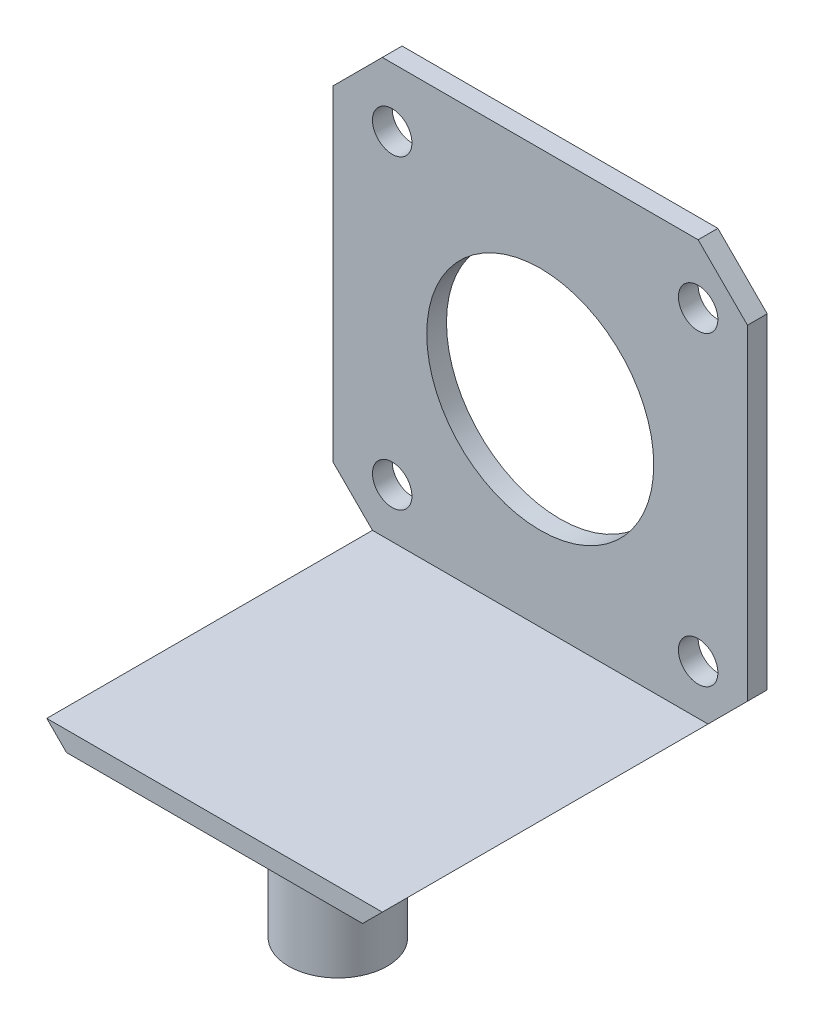
ISO-10303-21;
HEADER;
FILE_DESCRIPTION(('STEP AP214'),'2;1');
FILE_NAME('part.step','',(''),(''),'','','');
FILE_SCHEMA(('AUTOMOTIVE_DESIGN { 1 0 10303 214 1 1 1 1 }'));
ENDSEC;
DATA;
#1=APPLICATION_CONTEXT('core data for automotive mechanical design processes');
#2=APPLICATION_PROTOCOL_DEFINITION('international standard','automotive_design',2000,#1);
#3=PRODUCT_CONTEXT('',#1,'mechanical');
#4=PRODUCT('Part','Part','',(#3));
#5=PRODUCT_RELATED_PRODUCT_CATEGORY('part','',(#4));
#6=PRODUCT_DEFINITION_FORMATION('','',#4);
#7=PRODUCT_DEFINITION_CONTEXT('part definition',#1,'design');
#8=PRODUCT_DEFINITION('design','',#6,#7);
#9=PRODUCT_DEFINITION_SHAPE('','',#8);
#10=(LENGTH_UNIT() NAMED_UNIT(*) SI_UNIT(.MILLI.,.METRE.));
#11=(NAMED_UNIT(*) PLANE_ANGLE_UNIT() SI_UNIT($,.RADIAN.));
#12=(NAMED_UNIT(*) SI_UNIT($,.STERADIAN.) SOLID_ANGLE_UNIT());
#13=UNCERTAINTY_MEASURE_WITH_UNIT(LENGTH_MEASURE(1.E-05),#10,'distance_accuracy_value','');
#14=(GEOMETRIC_REPRESENTATION_CONTEXT(3) GLOBAL_UNCERTAINTY_ASSIGNED_CONTEXT((#13)) GLOBAL_UNIT_ASSIGNED_CONTEXT((#10,
#11,#12)) REPRESENTATION_CONTEXT('',''));
#15=CARTESIAN_POINT('',(0.,0.,0.));
#16=DIRECTION('',(0.,0.,1.));
#17=DIRECTION('',(1.,0.,0.));
#18=AXIS2_PLACEMENT_3D('',#15,#16,#17);
#19=CARTESIAN_POINT('',(0.,17.,0.));
#20=DIRECTION('',(0.,-1.,0.));
#21=DIRECTION('',(0.,0.,-1.));
#22=AXIS2_PLACEMENT_3D('',#19,#20,#21);
#23=PLANE('',#22);
#24=DIRECTION('',(-1.,0.,0.));
#25=VECTOR('',#24,1.);
#26=CARTESIAN_POINT('',(-21.,17.,12.5));
#27=LINE('',#26,#25);
#28=CARTESIAN_POINT('',(16.9999999999999,17.,12.5));
#29=VERTEX_POINT('',#28);
#30=CARTESIAN_POINT('',(-16.9999999999999,17.,12.5));
#31=VERTEX_POINT('',#30);
#32=EDGE_CURVE('E180',#29,#31,#27,.T.);
#33=ORIENTED_EDGE('',*,*,#32,.F.);
#34=DIRECTION('',(0.,0.,-1.));
#35=VECTOR('',#34,1.);
#36=CARTESIAN_POINT('',(16.9999999999999,17.,22.5));
#37=LINE('',#36,#35);
#38=CARTESIAN_POINT('',(16.9999999999999,17.,-20.5));
#39=VERTEX_POINT('',#38);
#40=EDGE_CURVE('E62',#29,#39,#37,.T.);
#41=ORIENTED_EDGE('',*,*,#40,.T.);
#42=DIRECTION('',(1.,0.,0.));
#43=VECTOR('',#42,1.);
#44=CARTESIAN_POINT('',(-21.,17.,-20.5));
#45=LINE('',#44,#43);
#46=CARTESIAN_POINT('',(-16.9999999999999,17.,-20.5));
#47=VERTEX_POINT('',#46);
#48=EDGE_CURVE('E165',#47,#39,#45,.T.);
#49=ORIENTED_EDGE('',*,*,#48,.F.);
#50=DIRECTION('',(0.,0.,1.));
#51=VECTOR('',#50,1.);
#52=CARTESIAN_POINT('',(-16.9999999999999,17.,22.5));
#53=LINE('',#52,#51);
#54=EDGE_CURVE('E213',#47,#31,#53,.T.);
#55=ORIENTED_EDGE('',*,*,#54,.T.);
#56=EDGE_LOOP('',(#33,#41,#49,#55));
#57=FACE_BOUND('',#56,.T.);
#58=ADVANCED_FACE('F39',(#57),#23,.F.);
#59=CARTESIAN_POINT('',(0.,15.,0.));
#60=DIRECTION('',(0.,-1.,0.));
#61=DIRECTION('',(0.,0.,-1.));
#62=AXIS2_PLACEMENT_3D('',#59,#60,#61);
#63=CYLINDRICAL_SURFACE('',#62,5.);
#64=CARTESIAN_POINT('',(0.,15.,0.));
#65=DIRECTION('',(0.,1.,0.));
#66=DIRECTION('',(0.,0.,1.));
#67=AXIS2_PLACEMENT_3D('',#64,#65,#66);
#68=CIRCLE('',#67,5.);
#69=CARTESIAN_POINT('',(0.,15.,5.));
#70=VERTEX_POINT('',#69);
#71=EDGE_CURVE('E156',#70,#70,#68,.T.);
#72=ORIENTED_EDGE('',*,*,#71,.F.);
#73=EDGE_LOOP('',(#72));
#74=FACE_BOUND('',#73,.T.);
#75=CARTESIAN_POINT('',(0.,0.,0.));
#76=DIRECTION('',(0.,1.,0.));
#77=DIRECTION('',(0.,0.,1.));
#78=AXIS2_PLACEMENT_3D('',#75,#76,#77);
#79=CIRCLE('',#78,5.);
#80=CARTESIAN_POINT('',(0.,0.,5.));
#81=VERTEX_POINT('',#80);
#82=EDGE_CURVE('E152',#81,#81,#79,.T.);
#83=ORIENTED_EDGE('',*,*,#82,.T.);
#84=EDGE_LOOP('',(#83));
#85=FACE_BOUND('',#84,.T.);
#86=ADVANCED_FACE('F260',(#74,#85),#63,.T.);
#87=CARTESIAN_POINT('',(0.,0.,0.));
#88=DIRECTION('',(0.,1.,0.));
#89=DIRECTION('',(0.,0.,1.));
#90=AXIS2_PLACEMENT_3D('',#87,#88,#89);
#91=PLANE('',#90);
#92=DIRECTION('',(0.,0.,1.));
#93=VECTOR('',#92,1.);
#94=CARTESIAN_POINT('',(-2.28148438974872,0.,-1.53535956027688));
#95=LINE('',#94,#93);
#96=CARTESIAN_POINT('',(-2.28148438974872,0.,-1.53535956027688));
#97=VERTEX_POINT('',#96);
#98=CARTESIAN_POINT('',(-2.28148438974872,0.,1.53535956027686));
#99=VERTEX_POINT('',#98);
#100=EDGE_CURVE('E149',#97,#99,#95,.T.);
#101=ORIENTED_EDGE('',*,*,#100,.T.);
#102=CARTESIAN_POINT('',(-1.47451495458029E-13,0.,0.));
#103=DIRECTION('',(0.,1.,0.));
#104=DIRECTION('',(0.,0.,1.));
#105=AXIS2_PLACEMENT_3D('',#102,#103,#104);
#106=CIRCLE('',#105,2.75);
#107=EDGE_CURVE('E138',#99,#97,#106,.T.);
#108=ORIENTED_EDGE('',*,*,#107,.T.);
#109=EDGE_LOOP('',(#101,#108));
#110=FACE_BOUND('',#109,.T.);
#111=ORIENTED_EDGE('',*,*,#82,.F.);
#112=EDGE_LOOP('',(#111));
#113=FACE_BOUND('',#112,.T.);
#114=ADVANCED_FACE('F257',(#110,#113),#91,.F.);
#115=CARTESIAN_POINT('',(-1.47451495458029E-13,0.,0.));
#116=DIRECTION('',(0.,1.,0.));
#117=DIRECTION('',(0.,0.,1.));
#118=AXIS2_PLACEMENT_3D('',#115,#116,#117);
#119=CYLINDRICAL_SURFACE('',#118,2.75);
#120=CARTESIAN_POINT('',(-1.47451495458029E-13,15.,0.));
#121=DIRECTION('',(0.,1.,0.));
#122=DIRECTION('',(0.,0.,1.));
#123=AXIS2_PLACEMENT_3D('',#120,#121,#122);
#124=CIRCLE('',#123,2.75);
#125=CARTESIAN_POINT('',(-2.28148438974872,15.,1.53535956027686));
#126=VERTEX_POINT('',#125);
#127=CARTESIAN_POINT('',(-2.28148438974872,15.,-1.53535956027688));
#128=VERTEX_POINT('',#127);
#129=EDGE_CURVE('E133',#126,#128,#124,.T.);
#130=ORIENTED_EDGE('',*,*,#129,.T.);
#131=DIRECTION('',(0.,1.,0.));
#132=VECTOR('',#131,1.);
#133=CARTESIAN_POINT('',(-2.28148438974872,0.,-1.53535956027688));
#134=LINE('',#133,#132);
#135=EDGE_CURVE('E142',#97,#128,#134,.T.);
#136=ORIENTED_EDGE('',*,*,#135,.F.);
#137=ORIENTED_EDGE('',*,*,#107,.F.);
#138=DIRECTION('',(0.,1.,0.));
#139=VECTOR('',#138,1.);
#140=CARTESIAN_POINT('',(-2.28148438974872,0.,1.53535956027686));
#141=LINE('',#140,#139);
#142=EDGE_CURVE('E144',#99,#126,#141,.T.);
#143=ORIENTED_EDGE('',*,*,#142,.T.);
#144=EDGE_LOOP('',(#130,#136,#137,#143));
#145=FACE_BOUND('',#144,.T.);
#146=ADVANCED_FACE('F141',(#145),#119,.F.);
#147=CARTESIAN_POINT('',(-2.28148438974872,0.,-1.53535956027688));
#148=DIRECTION('',(-1.,0.,0.));
#149=DIRECTION('',(0.,0.,1.));
#150=AXIS2_PLACEMENT_3D('',#147,#148,#149);
#151=PLANE('',#150);
#152=DIRECTION('',(0.,0.,1.));
#153=VECTOR('',#152,1.);
#154=CARTESIAN_POINT('',(-2.28148438974872,15.,-1.53535956027688));
#155=LINE('',#154,#153);
#156=EDGE_CURVE('E130',#128,#126,#155,.T.);
#157=ORIENTED_EDGE('',*,*,#156,.T.);
#158=ORIENTED_EDGE('',*,*,#142,.F.);
#159=ORIENTED_EDGE('',*,*,#100,.F.);
#160=ORIENTED_EDGE('',*,*,#135,.T.);
#161=EDGE_LOOP('',(#157,#158,#159,#160));
#162=FACE_BOUND('',#161,.T.);
#163=ADVANCED_FACE('F147',(#162),#151,.F.);
#164=CARTESIAN_POINT('',(0.,15.,0.));
#165=DIRECTION('',(0.,-1.,0.));
#166=DIRECTION('',(0.,0.,-1.));
#167=AXIS2_PLACEMENT_3D('',#164,#165,#166);
#168=PLANE('',#167);
#169=DIRECTION('',(-1.,0.,0.));
#170=VECTOR('',#169,1.);
#171=CARTESIAN_POINT('',(-21.,15.,-22.5));
#172=LINE('',#171,#170);
#173=CARTESIAN_POINT('',(14.9999999999999,15.,-22.5));
#174=VERTEX_POINT('',#173);
#175=CARTESIAN_POINT('',(-15.,15.,-22.5));
#176=VERTEX_POINT('',#175);
#177=EDGE_CURVE('E240',#174,#176,#172,.T.);
#178=ORIENTED_EDGE('',*,*,#177,.F.);
#179=DIRECTION('',(0.,0.,1.));
#180=VECTOR('',#179,1.);
#181=CARTESIAN_POINT('',(15.,15.,12.5));
#182=LINE('',#181,#180);
#183=CARTESIAN_POINT('',(15.,15.,12.5));
#184=VERTEX_POINT('',#183);
#185=EDGE_CURVE('E207',#174,#184,#182,.T.);
#186=ORIENTED_EDGE('',*,*,#185,.T.);
#187=DIRECTION('',(1.,0.,0.));
#188=VECTOR('',#187,1.);
#189=CARTESIAN_POINT('',(0.,15.,12.5));
#190=LINE('',#189,#188);
#191=CARTESIAN_POINT('',(-15.,15.,12.5));
#192=VERTEX_POINT('',#191);
#193=EDGE_CURVE('E320',#192,#184,#190,.T.);
#194=ORIENTED_EDGE('',*,*,#193,.F.);
#195=DIRECTION('',(0.,0.,-1.));
#196=VECTOR('',#195,1.);
#197=CARTESIAN_POINT('',(-15.,15.,-22.5));
#198=LINE('',#197,#196);
#199=EDGE_CURVE('E205',#192,#176,#198,.T.);
#200=ORIENTED_EDGE('',*,*,#199,.T.);
#201=EDGE_LOOP('',(#178,#186,#194,#200));
#202=FACE_BOUND('',#201,.T.);
#203=ORIENTED_EDGE('',*,*,#71,.T.);
#204=EDGE_LOOP('',(#203));
#205=FACE_BOUND('',#204,.T.);
#206=ADVANCED_FACE('F243',(#202,#205),#168,.T.);
#207=CARTESIAN_POINT('',(-21.,17.,22.5));
#208=DIRECTION('',(1.,0.,0.));
#209=DIRECTION('',(0.,0.,-1.));
#210=AXIS2_PLACEMENT_3D('',#207,#208,#209);
#211=PLANE('',#210);
#212=DIRECTION('',(0.,-1.,0.));
#213=VECTOR('',#212,1.);
#214=CARTESIAN_POINT('',(-21.,17.,-22.5));
#215=LINE('',#214,#213);
#216=CARTESIAN_POINT('',(-21.,54.,-22.5));
#217=VERTEX_POINT('',#216);
#218=CARTESIAN_POINT('',(-21.,21.0000000000001,-22.5));
#219=VERTEX_POINT('',#218);
#220=EDGE_CURVE('E248',#217,#219,#215,.T.);
#221=ORIENTED_EDGE('',*,*,#220,.T.);
#222=DIRECTION('',(0.,0.,1.));
#223=VECTOR('',#222,1.);
#224=CARTESIAN_POINT('',(-21.,21.0000000000001,12.5));
#225=LINE('',#224,#223);
#226=CARTESIAN_POINT('',(-21.,21.0000000000001,-20.5));
#227=VERTEX_POINT('',#226);
#228=EDGE_CURVE('E11',#219,#227,#225,.T.);
#229=ORIENTED_EDGE('',*,*,#228,.T.);
#230=DIRECTION('',(0.,-1.,0.));
#231=VECTOR('',#230,1.);
#232=CARTESIAN_POINT('',(-21.,59.,-20.5));
#233=LINE('',#232,#231);
#234=CARTESIAN_POINT('',(-21.,54.,-20.5));
#235=VERTEX_POINT('',#234);
#236=EDGE_CURVE('E230',#235,#227,#233,.T.);
#237=ORIENTED_EDGE('',*,*,#236,.F.);
#238=DIRECTION('',(0.,0.,-1.));
#239=VECTOR('',#238,1.);
#240=CARTESIAN_POINT('',(-21.,54.,-22.5));
#241=LINE('',#240,#239);
#242=EDGE_CURVE('E196',#235,#217,#241,.T.);
#243=ORIENTED_EDGE('',*,*,#242,.T.);
#244=EDGE_LOOP('',(#221,#229,#237,#243));
#245=FACE_BOUND('',#244,.T.);
#246=ADVANCED_FACE('F302',(#245),#211,.F.);
#247=CARTESIAN_POINT('',(-21.,17.,-22.5));
#248=DIRECTION('',(0.,0.,1.));
#249=DIRECTION('',(1.,0.,0.));
#250=AXIS2_PLACEMENT_3D('',#247,#248,#249);
#251=PLANE('',#250);
#252=CARTESIAN_POINT('',(16.,53.,-22.5));
#253=DIRECTION('',(0.,0.,-1.));
#254=DIRECTION('',(-1.,0.,0.));
#255=AXIS2_PLACEMENT_3D('',#252,#253,#254);
#256=CIRCLE('',#255,2.);
#257=CARTESIAN_POINT('',(14.,53.,-22.5));
#258=VERTEX_POINT('',#257);
#259=EDGE_CURVE('E326',#258,#258,#256,.T.);
#260=ORIENTED_EDGE('',*,*,#259,.F.);
#261=EDGE_LOOP('',(#260));
#262=FACE_BOUND('',#261,.T.);
#263=CARTESIAN_POINT('',(-15.,22.,-22.5));
#264=DIRECTION('',(0.,0.,-1.));
#265=DIRECTION('',(-1.,0.,0.));
#266=AXIS2_PLACEMENT_3D('',#263,#264,#265);
#267=CIRCLE('',#266,2.00000000000001);
#268=CARTESIAN_POINT('',(-17.,22.,-22.5));
#269=VERTEX_POINT('',#268);
#270=EDGE_CURVE('E327',#269,#269,#267,.T.);
#271=ORIENTED_EDGE('',*,*,#270,.F.);
#272=EDGE_LOOP('',(#271));
#273=FACE_BOUND('',#272,.T.);
#274=CARTESIAN_POINT('',(16.,22.,-22.5));
#275=DIRECTION('',(0.,0.,-1.));
#276=DIRECTION('',(-1.,0.,0.));
#277=AXIS2_PLACEMENT_3D('',#274,#275,#276);
#278=CIRCLE('',#277,2.);
#279=CARTESIAN_POINT('',(14.,22.,-22.5));
#280=VERTEX_POINT('',#279);
#281=EDGE_CURVE('E330',#280,#280,#278,.T.);
#282=ORIENTED_EDGE('',*,*,#281,.F.);
#283=EDGE_LOOP('',(#282));
#284=FACE_BOUND('',#283,.T.);
#285=CARTESIAN_POINT('',(-15.,53.,-22.5));
#286=DIRECTION('',(0.,0.,-1.));
#287=DIRECTION('',(-1.,0.,0.));
#288=AXIS2_PLACEMENT_3D('',#285,#286,#287);
#289=CIRCLE('',#288,2.00000000000001);
#290=CARTESIAN_POINT('',(-17.,53.,-22.5));
#291=VERTEX_POINT('',#290);
#292=EDGE_CURVE('E171',#291,#291,#289,.T.);
#293=ORIENTED_EDGE('',*,*,#292,.F.);
#294=EDGE_LOOP('',(#293));
#295=FACE_BOUND('',#294,.T.);
#296=CARTESIAN_POINT('',(0.,37.,-22.5));
#297=DIRECTION('',(0.,0.,-1.));
#298=DIRECTION('',(-1.,0.,0.));
#299=AXIS2_PLACEMENT_3D('',#296,#297,#298);
#300=CIRCLE('',#299,11.5);
#301=CARTESIAN_POINT('',(-11.5,37.,-22.5));
#302=VERTEX_POINT('',#301);
#303=EDGE_CURVE('E166',#302,#302,#300,.T.);
#304=ORIENTED_EDGE('',*,*,#303,.F.);
#305=EDGE_LOOP('',(#304));
#306=FACE_BOUND('',#305,.T.);
#307=DIRECTION('',(0.,-1.,0.));
#308=VECTOR('',#307,1.);
#309=CARTESIAN_POINT('',(21.,17.,-22.5));
#310=LINE('',#309,#308);
#311=CARTESIAN_POINT('',(21.,54.,-22.5));
#312=VERTEX_POINT('',#311);
#313=CARTESIAN_POINT('',(21.,21.0000000000001,-22.5));
#314=VERTEX_POINT('',#313);
#315=EDGE_CURVE('E145',#312,#314,#310,.T.);
#316=ORIENTED_EDGE('',*,*,#315,.T.);
#317=DIRECTION('',(-0.707106781186544,-0.707106781186551,0.));
#318=VECTOR('',#317,1.);
#319=CARTESIAN_POINT('',(21.,21.0000000000001,-22.5));
#320=LINE('',#319,#318);
#321=EDGE_CURVE('E203',#314,#174,#320,.T.);
#322=ORIENTED_EDGE('',*,*,#321,.T.);
#323=ORIENTED_EDGE('',*,*,#177,.T.);
#324=DIRECTION('',(-0.707106781186544,0.707106781186551,0.));
#325=VECTOR('',#324,1.);
#326=CARTESIAN_POINT('',(-21.,21.0000000000001,-22.5));
#327=LINE('',#326,#325);
#328=EDGE_CURVE('E201',#176,#219,#327,.T.);
#329=ORIENTED_EDGE('',*,*,#328,.T.);
#330=ORIENTED_EDGE('',*,*,#220,.F.);
#331=DIRECTION('',(0.707106781186547,0.707106781186549,0.));
#332=VECTOR('',#331,1.);
#333=CARTESIAN_POINT('',(-16.,59.,-22.5));
#334=LINE('',#333,#332);
#335=CARTESIAN_POINT('',(-16.,59.,-22.5));
#336=VERTEX_POINT('',#335);
#337=EDGE_CURVE('E186',#217,#336,#334,.T.);
#338=ORIENTED_EDGE('',*,*,#337,.T.);
#339=DIRECTION('',(-1.,0.,0.));
#340=VECTOR('',#339,1.);
#341=CARTESIAN_POINT('',(-21.,59.,-22.5));
#342=LINE('',#341,#340);
#343=CARTESIAN_POINT('',(16.,59.,-22.5));
#344=VERTEX_POINT('',#343);
#345=EDGE_CURVE('E231',#344,#336,#342,.T.);
#346=ORIENTED_EDGE('',*,*,#345,.F.);
#347=DIRECTION('',(0.707106781186547,-0.707106781186549,0.));
#348=VECTOR('',#347,1.);
#349=CARTESIAN_POINT('',(16.,59.,-22.5));
#350=LINE('',#349,#348);
#351=EDGE_CURVE('E188',#344,#312,#350,.T.);
#352=ORIENTED_EDGE('',*,*,#351,.T.);
#353=EDGE_LOOP('',(#316,#322,#323,#329,#330,#338,#346,#352));
#354=FACE_BOUND('',#353,.T.);
#355=ADVANCED_FACE('F239',(#262,#273,#284,#295,#306,#354),#251,.F.);
#356=CARTESIAN_POINT('',(21.,17.,22.5));
#357=DIRECTION('',(-1.,0.,0.));
#358=DIRECTION('',(0.,0.,1.));
#359=AXIS2_PLACEMENT_3D('',#356,#357,#358);
#360=PLANE('',#359);
#361=DIRECTION('',(0.,-1.,0.));
#362=VECTOR('',#361,1.);
#363=CARTESIAN_POINT('',(21.,59.,-20.5));
#364=LINE('',#363,#362);
#365=CARTESIAN_POINT('',(21.,54.,-20.5));
#366=VERTEX_POINT('',#365);
#367=CARTESIAN_POINT('',(21.,21.0000000000001,-20.5));
#368=VERTEX_POINT('',#367);
#369=EDGE_CURVE('E221',#366,#368,#364,.T.);
#370=ORIENTED_EDGE('',*,*,#369,.T.);
#371=DIRECTION('',(0.,0.,-1.));
#372=VECTOR('',#371,1.);
#373=CARTESIAN_POINT('',(21.,21.0000000000001,-22.5));
#374=LINE('',#373,#372);
#375=EDGE_CURVE('E198',#368,#314,#374,.T.);
#376=ORIENTED_EDGE('',*,*,#375,.T.);
#377=ORIENTED_EDGE('',*,*,#315,.F.);
#378=DIRECTION('',(0.,0.,1.));
#379=VECTOR('',#378,1.);
#380=CARTESIAN_POINT('',(21.,54.,-20.5));
#381=LINE('',#380,#379);
#382=EDGE_CURVE('E190',#312,#366,#381,.T.);
#383=ORIENTED_EDGE('',*,*,#382,.T.);
#384=EDGE_LOOP('',(#370,#376,#377,#383));
#385=FACE_BOUND('',#384,.T.);
#386=ADVANCED_FACE('F226',(#385),#360,.F.);
#387=ORIENTED_EDGE('',*,*,#129,.F.);
#388=ORIENTED_EDGE('',*,*,#156,.F.);
#389=EDGE_LOOP('',(#387,#388));
#390=FACE_BOUND('',#389,.T.);
#391=ADVANCED_FACE('F132',(#390),#168,.T.);
#392=CARTESIAN_POINT('',(-21.,59.,-20.5));
#393=DIRECTION('',(0.,0.,-1.));
#394=DIRECTION('',(-1.,0.,0.));
#395=AXIS2_PLACEMENT_3D('',#392,#393,#394);
#396=PLANE('',#395);
#397=CARTESIAN_POINT('',(16.,53.,-20.5));
#398=DIRECTION('',(0.,0.,-1.));
#399=DIRECTION('',(-1.,0.,0.));
#400=AXIS2_PLACEMENT_3D('',#397,#398,#399);
#401=CIRCLE('',#400,2.);
#402=CARTESIAN_POINT('',(14.,53.,-20.5));
#403=VERTEX_POINT('',#402);
#404=EDGE_CURVE('E177',#403,#403,#401,.T.);
#405=ORIENTED_EDGE('',*,*,#404,.T.);
#406=EDGE_LOOP('',(#405));
#407=FACE_BOUND('',#406,.T.);
#408=CARTESIAN_POINT('',(-15.,22.,-20.5));
#409=DIRECTION('',(0.,0.,-1.));
#410=DIRECTION('',(-1.,0.,0.));
#411=AXIS2_PLACEMENT_3D('',#408,#409,#410);
#412=CIRCLE('',#411,2.00000000000001);
#413=CARTESIAN_POINT('',(-17.,22.,-20.5));
#414=VERTEX_POINT('',#413);
#415=EDGE_CURVE('E174',#414,#414,#412,.T.);
#416=ORIENTED_EDGE('',*,*,#415,.T.);
#417=EDGE_LOOP('',(#416));
#418=FACE_BOUND('',#417,.T.);
#419=CARTESIAN_POINT('',(16.,22.,-20.5));
#420=DIRECTION('',(0.,0.,-1.));
#421=DIRECTION('',(-1.,0.,0.));
#422=AXIS2_PLACEMENT_3D('',#419,#420,#421);
#423=CIRCLE('',#422,2.);
#424=CARTESIAN_POINT('',(14.,22.,-20.5));
#425=VERTEX_POINT('',#424);
#426=EDGE_CURVE('E170',#425,#425,#423,.T.);
#427=ORIENTED_EDGE('',*,*,#426,.T.);
#428=EDGE_LOOP('',(#427));
#429=FACE_BOUND('',#428,.T.);
#430=CARTESIAN_POINT('',(-15.,53.,-20.5));
#431=DIRECTION('',(0.,0.,-1.));
#432=DIRECTION('',(-1.,0.,0.));
#433=AXIS2_PLACEMENT_3D('',#430,#431,#432);
#434=CIRCLE('',#433,2.00000000000001);
#435=CARTESIAN_POINT('',(-17.,53.,-20.5));
#436=VERTEX_POINT('',#435);
#437=EDGE_CURVE('E167',#436,#436,#434,.T.);
#438=ORIENTED_EDGE('',*,*,#437,.T.);
#439=EDGE_LOOP('',(#438));
#440=FACE_BOUND('',#439,.T.);
#441=CARTESIAN_POINT('',(0.,37.,-20.5));
#442=DIRECTION('',(0.,0.,-1.));
#443=DIRECTION('',(-1.,0.,0.));
#444=AXIS2_PLACEMENT_3D('',#441,#442,#443);
#445=CIRCLE('',#444,11.5);
#446=CARTESIAN_POINT('',(-11.5,37.,-20.5));
#447=VERTEX_POINT('',#446);
#448=EDGE_CURVE('E162',#447,#447,#445,.T.);
#449=ORIENTED_EDGE('',*,*,#448,.T.);
#450=EDGE_LOOP('',(#449));
#451=FACE_BOUND('',#450,.T.);
#452=ORIENTED_EDGE('',*,*,#48,.T.);
#453=DIRECTION('',(0.707106781186544,0.707106781186551,0.));
#454=VECTOR('',#453,1.);
#455=CARTESIAN_POINT('',(21.,21.0000000000001,-20.5));
#456=LINE('',#455,#454);
#457=EDGE_CURVE('E48',#39,#368,#456,.T.);
#458=ORIENTED_EDGE('',*,*,#457,.T.);
#459=ORIENTED_EDGE('',*,*,#369,.F.);
#460=DIRECTION('',(-0.707106781186547,0.707106781186549,0.));
#461=VECTOR('',#460,1.);
#462=CARTESIAN_POINT('',(16.,59.,-20.5));
#463=LINE('',#462,#461);
#464=CARTESIAN_POINT('',(16.,59.,-20.5));
#465=VERTEX_POINT('',#464);
#466=EDGE_CURVE('E194',#366,#465,#463,.T.);
#467=ORIENTED_EDGE('',*,*,#466,.T.);
#468=DIRECTION('',(1.,0.,0.));
#469=VECTOR('',#468,1.);
#470=CARTESIAN_POINT('',(-21.,59.,-20.5));
#471=LINE('',#470,#469);
#472=CARTESIAN_POINT('',(-16.,59.,-20.5));
#473=VERTEX_POINT('',#472);
#474=EDGE_CURVE('E313',#473,#465,#471,.T.);
#475=ORIENTED_EDGE('',*,*,#474,.F.);
#476=DIRECTION('',(-0.707106781186547,-0.707106781186549,0.));
#477=VECTOR('',#476,1.);
#478=CARTESIAN_POINT('',(-16.,59.,-20.5));
#479=LINE('',#478,#477);
#480=EDGE_CURVE('E192',#473,#235,#479,.T.);
#481=ORIENTED_EDGE('',*,*,#480,.T.);
#482=ORIENTED_EDGE('',*,*,#236,.T.);
#483=DIRECTION('',(0.707106781186544,-0.707106781186551,0.));
#484=VECTOR('',#483,1.);
#485=CARTESIAN_POINT('',(-21.,21.0000000000001,-20.5));
#486=LINE('',#485,#484);
#487=EDGE_CURVE('E55',#227,#47,#486,.T.);
#488=ORIENTED_EDGE('',*,*,#487,.T.);
#489=EDGE_LOOP('',(#452,#458,#459,#467,#475,#481,#482,#488));
#490=FACE_BOUND('',#489,.T.);
#491=ADVANCED_FACE('F220',(#407,#418,#429,#440,#451,#490),#396,.F.);
#492=CARTESIAN_POINT('',(0.,59.,0.));
#493=DIRECTION('',(0.,1.,0.));
#494=DIRECTION('',(0.,0.,1.));
#495=AXIS2_PLACEMENT_3D('',#492,#493,#494);
#496=PLANE('',#495);
#497=ORIENTED_EDGE('',*,*,#474,.T.);
#498=DIRECTION('',(0.,0.,-1.));
#499=VECTOR('',#498,1.);
#500=CARTESIAN_POINT('',(16.,59.,-22.5));
#501=LINE('',#500,#499);
#502=EDGE_CURVE('E183',#465,#344,#501,.T.);
#503=ORIENTED_EDGE('',*,*,#502,.T.);
#504=ORIENTED_EDGE('',*,*,#345,.T.);
#505=DIRECTION('',(0.,0.,1.));
#506=VECTOR('',#505,1.);
#507=CARTESIAN_POINT('',(-16.,59.,-20.5));
#508=LINE('',#507,#506);
#509=EDGE_CURVE('E159',#336,#473,#508,.T.);
#510=ORIENTED_EDGE('',*,*,#509,.T.);
#511=EDGE_LOOP('',(#497,#503,#504,#510));
#512=FACE_BOUND('',#511,.T.);
#513=ADVANCED_FACE('F310',(#512),#496,.T.);
#514=CARTESIAN_POINT('',(0.,37.,-12.5));
#515=DIRECTION('',(0.,0.,-1.));
#516=DIRECTION('',(-1.,0.,0.));
#517=AXIS2_PLACEMENT_3D('',#514,#515,#516);
#518=CYLINDRICAL_SURFACE('',#517,11.5);
#519=ORIENTED_EDGE('',*,*,#303,.T.);
#520=EDGE_LOOP('',(#519));
#521=FACE_BOUND('',#520,.T.);
#522=ORIENTED_EDGE('',*,*,#448,.F.);
#523=EDGE_LOOP('',(#522));
#524=FACE_BOUND('',#523,.T.);
#525=ADVANCED_FACE('F347',(#521,#524),#518,.F.);
#526=CARTESIAN_POINT('',(-21.,7.,12.5));
#527=DIRECTION('',(0.,0.,-1.));
#528=DIRECTION('',(-1.,0.,0.));
#529=AXIS2_PLACEMENT_3D('',#526,#527,#528);
#530=PLANE('',#529);
#531=ORIENTED_EDGE('',*,*,#193,.T.);
#532=DIRECTION('',(0.707106781186544,0.707106781186551,0.));
#533=VECTOR('',#532,1.);
#534=CARTESIAN_POINT('',(21.,21.0000000000001,12.5));
#535=LINE('',#534,#533);
#536=EDGE_CURVE('E211',#184,#29,#535,.T.);
#537=ORIENTED_EDGE('',*,*,#536,.T.);
#538=ORIENTED_EDGE('',*,*,#32,.T.);
#539=DIRECTION('',(0.707106781186544,-0.707106781186551,0.));
#540=VECTOR('',#539,1.);
#541=CARTESIAN_POINT('',(-21.,21.0000000000001,12.5));
#542=LINE('',#541,#540);
#543=EDGE_CURVE('E209',#31,#192,#542,.T.);
#544=ORIENTED_EDGE('',*,*,#543,.T.);
#545=EDGE_LOOP('',(#531,#537,#538,#544));
#546=FACE_BOUND('',#545,.T.);
#547=ADVANCED_FACE('F350',(#546),#530,.F.);
#548=CARTESIAN_POINT('',(-15.,53.,-12.5));
#549=DIRECTION('',(0.,0.,-1.));
#550=DIRECTION('',(-1.,0.,0.));
#551=AXIS2_PLACEMENT_3D('',#548,#549,#550);
#552=CYLINDRICAL_SURFACE('',#551,2.00000000000001);
#553=ORIENTED_EDGE('',*,*,#292,.T.);
#554=EDGE_LOOP('',(#553));
#555=FACE_BOUND('',#554,.T.);
#556=ORIENTED_EDGE('',*,*,#437,.F.);
#557=EDGE_LOOP('',(#556));
#558=FACE_BOUND('',#557,.T.);
#559=ADVANCED_FACE('F437',(#555,#558),#552,.F.);
#560=CARTESIAN_POINT('',(16.,22.,-12.5));
#561=DIRECTION('',(0.,0.,-1.));
#562=DIRECTION('',(-1.,0.,0.));
#563=AXIS2_PLACEMENT_3D('',#560,#561,#562);
#564=CYLINDRICAL_SURFACE('',#563,2.);
#565=ORIENTED_EDGE('',*,*,#281,.T.);
#566=EDGE_LOOP('',(#565));
#567=FACE_BOUND('',#566,.T.);
#568=ORIENTED_EDGE('',*,*,#426,.F.);
#569=EDGE_LOOP('',(#568));
#570=FACE_BOUND('',#569,.T.);
#571=ADVANCED_FACE('F336',(#567,#570),#564,.F.);
#572=CARTESIAN_POINT('',(-15.,22.,-12.5));
#573=DIRECTION('',(0.,0.,-1.));
#574=DIRECTION('',(-1.,0.,0.));
#575=AXIS2_PLACEMENT_3D('',#572,#573,#574);
#576=CYLINDRICAL_SURFACE('',#575,2.00000000000001);
#577=ORIENTED_EDGE('',*,*,#270,.T.);
#578=EDGE_LOOP('',(#577));
#579=FACE_BOUND('',#578,.T.);
#580=ORIENTED_EDGE('',*,*,#415,.F.);
#581=EDGE_LOOP('',(#580));
#582=FACE_BOUND('',#581,.T.);
#583=ADVANCED_FACE('F453',(#579,#582),#576,.F.);
#584=CARTESIAN_POINT('',(16.,53.,-12.5));
#585=DIRECTION('',(0.,0.,-1.));
#586=DIRECTION('',(-1.,0.,0.));
#587=AXIS2_PLACEMENT_3D('',#584,#585,#586);
#588=CYLINDRICAL_SURFACE('',#587,2.);
#589=ORIENTED_EDGE('',*,*,#259,.T.);
#590=EDGE_LOOP('',(#589));
#591=FACE_BOUND('',#590,.T.);
#592=ORIENTED_EDGE('',*,*,#404,.F.);
#593=EDGE_LOOP('',(#592));
#594=FACE_BOUND('',#593,.T.);
#595=ADVANCED_FACE('F283',(#591,#594),#588,.F.);
#596=CARTESIAN_POINT('',(16.,59.,0.));
#597=DIRECTION('',(0.707106781186549,0.707106781186547,0.));
#598=DIRECTION('',(0.,0.,1.));
#599=AXIS2_PLACEMENT_3D('',#596,#597,#598);
#600=PLANE('',#599);
#601=ORIENTED_EDGE('',*,*,#466,.F.);
#602=ORIENTED_EDGE('',*,*,#382,.F.);
#603=ORIENTED_EDGE('',*,*,#351,.F.);
#604=ORIENTED_EDGE('',*,*,#502,.F.);
#605=EDGE_LOOP('',(#601,#602,#603,#604));
#606=FACE_BOUND('',#605,.T.);
#607=ADVANCED_FACE('F276',(#606),#600,.T.);
#608=CARTESIAN_POINT('',(-16.,59.,0.));
#609=DIRECTION('',(-0.707106781186549,0.707106781186547,0.));
#610=DIRECTION('',(0.,0.,-1.));
#611=AXIS2_PLACEMENT_3D('',#608,#609,#610);
#612=PLANE('',#611);
#613=ORIENTED_EDGE('',*,*,#337,.F.);
#614=ORIENTED_EDGE('',*,*,#242,.F.);
#615=ORIENTED_EDGE('',*,*,#480,.F.);
#616=ORIENTED_EDGE('',*,*,#509,.F.);
#617=EDGE_LOOP('',(#613,#614,#615,#616));
#618=FACE_BOUND('',#617,.T.);
#619=ADVANCED_FACE('F282',(#618),#612,.T.);
#620=CARTESIAN_POINT('',(21.,21.0000000000001,22.5));
#621=DIRECTION('',(0.707106781186551,-0.707106781186544,0.));
#622=DIRECTION('',(0.,0.,1.));
#623=AXIS2_PLACEMENT_3D('',#620,#621,#622);
#624=PLANE('',#623);
#625=ORIENTED_EDGE('',*,*,#536,.F.);
#626=ORIENTED_EDGE('',*,*,#185,.F.);
#627=ORIENTED_EDGE('',*,*,#321,.F.);
#628=ORIENTED_EDGE('',*,*,#375,.F.);
#629=ORIENTED_EDGE('',*,*,#457,.F.);
#630=ORIENTED_EDGE('',*,*,#40,.F.);
#631=EDGE_LOOP('',(#625,#626,#627,#628,#629,#630));
#632=FACE_BOUND('',#631,.T.);
#633=ADVANCED_FACE('F234',(#632),#624,.T.);
#634=CARTESIAN_POINT('',(-21.,21.0000000000001,22.5));
#635=DIRECTION('',(-0.707106781186551,-0.707106781186544,0.));
#636=DIRECTION('',(0.,0.,-1.));
#637=AXIS2_PLACEMENT_3D('',#634,#635,#636);
#638=PLANE('',#637);
#639=ORIENTED_EDGE('',*,*,#328,.F.);
#640=ORIENTED_EDGE('',*,*,#199,.F.);
#641=ORIENTED_EDGE('',*,*,#543,.F.);
#642=ORIENTED_EDGE('',*,*,#54,.F.);
#643=ORIENTED_EDGE('',*,*,#487,.F.);
#644=ORIENTED_EDGE('',*,*,#228,.F.);
#645=EDGE_LOOP('',(#639,#640,#641,#642,#643,#644));
#646=FACE_BOUND('',#645,.T.);
#647=ADVANCED_FACE('F42',(#646),#638,.T.);
#648=CLOSED_SHELL('',(#58,#86,#114,#146,#163,#206,#246,#355,#386,#391,#491,#513,#525,#547,#559,
#571,#583,#595,#607,#619,#633,#647));
#649=MANIFOLD_SOLID_BREP('B2',#648);
#650=ADVANCED_BREP_SHAPE_REPRESENTATION('',(#18,#649),#14);
#651=SHAPE_DEFINITION_REPRESENTATION(#9,#650);
ENDSEC;
END-ISO-10303-21;
